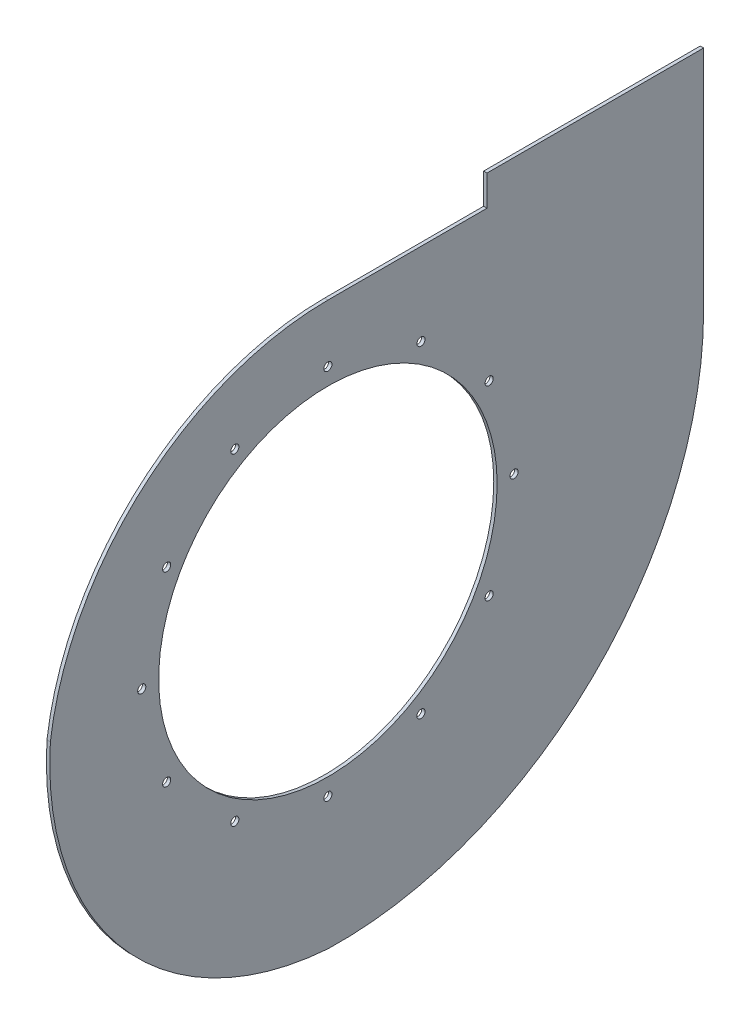
ISO-10303-21;
HEADER;
FILE_DESCRIPTION(('STEP AP214'),'2;1');
FILE_NAME('part.step','',(''),(''),'','','');
FILE_SCHEMA(('AUTOMOTIVE_DESIGN { 1 0 10303 214 1 1 1 1 }'));
ENDSEC;
DATA;
#1=APPLICATION_CONTEXT('core data for automotive mechanical design processes');
#2=APPLICATION_PROTOCOL_DEFINITION('international standard','automotive_design',2000,#1);
#3=PRODUCT_CONTEXT('',#1,'mechanical');
#4=PRODUCT('Part','Part','',(#3));
#5=PRODUCT_RELATED_PRODUCT_CATEGORY('part','',(#4));
#6=PRODUCT_DEFINITION_FORMATION('','',#4);
#7=PRODUCT_DEFINITION_CONTEXT('part definition',#1,'design');
#8=PRODUCT_DEFINITION('design','',#6,#7);
#9=PRODUCT_DEFINITION_SHAPE('','',#8);
#10=(LENGTH_UNIT() NAMED_UNIT(*) SI_UNIT(.MILLI.,.METRE.));
#11=(NAMED_UNIT(*) PLANE_ANGLE_UNIT() SI_UNIT($,.RADIAN.));
#12=(NAMED_UNIT(*) SI_UNIT($,.STERADIAN.) SOLID_ANGLE_UNIT());
#13=UNCERTAINTY_MEASURE_WITH_UNIT(LENGTH_MEASURE(1.E-05),#10,'distance_accuracy_value','');
#14=(GEOMETRIC_REPRESENTATION_CONTEXT(3) GLOBAL_UNCERTAINTY_ASSIGNED_CONTEXT((#13)) GLOBAL_UNIT_ASSIGNED_CONTEXT((#10,
#11,#12)) REPRESENTATION_CONTEXT('',''));
#15=CARTESIAN_POINT('',(0.,0.,0.));
#16=DIRECTION('',(0.,0.,1.));
#17=DIRECTION('',(1.,0.,0.));
#18=AXIS2_PLACEMENT_3D('',#15,#16,#17);
#19=CARTESIAN_POINT('',(5.,-290.185837618395,361.560614636202));
#20=DIRECTION('',(1.,0.,0.));
#21=DIRECTION('',(0.,0.,-1.));
#22=AXIS2_PLACEMENT_3D('',#19,#20,#21);
#23=PLANE('',#22);
#24=CARTESIAN_POINT('',(5.,1.92749378432888,224.485698368693));
#25=DIRECTION('',(1.,0.,0.));
#26=DIRECTION('',(0.,0.86602540378444,-0.499999999999998));
#27=AXIS2_PLACEMENT_3D('',#24,#25,#26);
#28=CIRCLE('',#27,6.);
#29=CARTESIAN_POINT('',(5.,7.12364620703552,221.485698368693));
#30=VERTEX_POINT('',#29);
#31=EDGE_CURVE('E322',#30,#30,#28,.T.);
#32=ORIENTED_EDGE('',*,*,#31,.F.);
#33=EDGE_LOOP('',(#32));
#34=FACE_BOUND('',#33,.T.);
#35=CARTESIAN_POINT('',(5.,38.7705077436079,361.985698368694));
#36=DIRECTION('',(1.,0.,0.));
#37=DIRECTION('',(0.,1.,0.));
#38=AXIS2_PLACEMENT_3D('',#35,#36,#37);
#39=CIRCLE('',#38,6.);
#40=CARTESIAN_POINT('',(5.,44.7705077436079,361.985698368694));
#41=VERTEX_POINT('',#40);
#42=EDGE_CURVE('E325',#41,#41,#39,.T.);
#43=ORIENTED_EDGE('',*,*,#42,.F.);
#44=EDGE_LOOP('',(#43));
#45=FACE_BOUND('',#44,.T.);
#46=CARTESIAN_POINT('',(5.,1.92749378432788,499.485698368694));
#47=DIRECTION('',(1.,0.,0.));
#48=DIRECTION('',(0.,0.866025403784436,0.500000000000004));
#49=AXIS2_PLACEMENT_3D('',#46,#47,#48);
#50=CIRCLE('',#49,6.);
#51=CARTESIAN_POINT('',(5.,7.12364620703451,502.485698368694));
#52=VERTEX_POINT('',#51);
#53=EDGE_CURVE('E328',#52,#52,#50,.T.);
#54=ORIENTED_EDGE('',*,*,#53,.F.);
#55=EDGE_LOOP('',(#54));
#56=FACE_BOUND('',#55,.T.);
#57=CARTESIAN_POINT('',(5.,-98.7294922563935,600.142684409414));
#58=DIRECTION('',(1.,0.,0.));
#59=DIRECTION('',(0.,0.499999999999995,0.866025403784442));
#60=AXIS2_PLACEMENT_3D('',#57,#58,#59);
#61=CIRCLE('',#60,6.);
#62=CARTESIAN_POINT('',(5.,-95.7294922563935,605.338836832121));
#63=VERTEX_POINT('',#62);
#64=EDGE_CURVE('E331',#63,#63,#61,.T.);
#65=ORIENTED_EDGE('',*,*,#64,.F.);
#66=EDGE_LOOP('',(#65));
#67=FACE_BOUND('',#66,.T.);
#68=CARTESIAN_POINT('',(5.,-236.229492256392,636.985698368693));
#69=DIRECTION('',(1.,0.,0.));
#70=DIRECTION('',(0.,0.,1.));
#71=AXIS2_PLACEMENT_3D('',#68,#69,#70);
#72=CIRCLE('',#71,6.);
#73=CARTESIAN_POINT('',(5.,-236.229492256392,642.985698368693));
#74=VERTEX_POINT('',#73);
#75=EDGE_CURVE('E334',#74,#74,#72,.T.);
#76=ORIENTED_EDGE('',*,*,#75,.F.);
#77=EDGE_LOOP('',(#76));
#78=FACE_BOUND('',#77,.T.);
#79=CARTESIAN_POINT('',(5.,-373.729492256394,600.142684409412));
#80=DIRECTION('',(1.,0.,0.));
#81=DIRECTION('',(0.,-0.500000000000007,0.866025403784435));
#82=AXIS2_PLACEMENT_3D('',#79,#80,#81);
#83=CIRCLE('',#82,6.);
#84=CARTESIAN_POINT('',(5.,-376.729492256394,605.338836832119));
#85=VERTEX_POINT('',#84);
#86=EDGE_CURVE('E337',#85,#85,#83,.T.);
#87=ORIENTED_EDGE('',*,*,#86,.F.);
#88=EDGE_LOOP('',(#87));
#89=FACE_BOUND('',#88,.T.);
#90=CARTESIAN_POINT('',(5.,-474.386478297114,499.485698368691));
#91=DIRECTION('',(1.,0.,0.));
#92=DIRECTION('',(0.,-0.866025403784443,0.499999999999992));
#93=AXIS2_PLACEMENT_3D('',#90,#91,#92);
#94=CIRCLE('',#93,6.);
#95=CARTESIAN_POINT('',(5.,-479.582630719821,502.485698368691));
#96=VERTEX_POINT('',#95);
#97=EDGE_CURVE('E318',#96,#96,#94,.T.);
#98=ORIENTED_EDGE('',*,*,#97,.F.);
#99=EDGE_LOOP('',(#98));
#100=FACE_BOUND('',#99,.T.);
#101=CARTESIAN_POINT('',(5.,-511.229492256392,361.98569836869));
#102=DIRECTION('',(1.,0.,0.));
#103=DIRECTION('',(0.,-1.,0.));
#104=AXIS2_PLACEMENT_3D('',#101,#102,#103);
#105=CIRCLE('',#104,6.);
#106=CARTESIAN_POINT('',(5.,-517.229492256392,361.98569836869));
#107=VERTEX_POINT('',#106);
#108=EDGE_CURVE('E314',#107,#107,#105,.T.);
#109=ORIENTED_EDGE('',*,*,#108,.F.);
#110=EDGE_LOOP('',(#109));
#111=FACE_BOUND('',#110,.T.);
#112=CARTESIAN_POINT('',(5.,-474.386478297111,224.48569836869));
#113=DIRECTION('',(1.,0.,0.));
#114=DIRECTION('',(0.,-0.866025403784433,-0.50000000000001));
#115=AXIS2_PLACEMENT_3D('',#112,#113,#114);
#116=CIRCLE('',#115,6.);
#117=CARTESIAN_POINT('',(5.,-479.582630719818,221.48569836869));
#118=VERTEX_POINT('',#117);
#119=EDGE_CURVE('E301',#118,#118,#116,.T.);
#120=ORIENTED_EDGE('',*,*,#119,.F.);
#121=EDGE_LOOP('',(#120));
#122=FACE_BOUND('',#121,.T.);
#123=CARTESIAN_POINT('',(5.,-373.729492256389,123.82871232797));
#124=DIRECTION('',(1.,0.,0.));
#125=DIRECTION('',(0.,-0.499999999999989,-0.866025403784445));
#126=AXIS2_PLACEMENT_3D('',#123,#124,#125);
#127=CIRCLE('',#126,6.);
#128=CARTESIAN_POINT('',(5.,-376.729492256389,118.632559905264));
#129=VERTEX_POINT('',#128);
#130=EDGE_CURVE('E315',#129,#129,#127,.T.);
#131=ORIENTED_EDGE('',*,*,#130,.F.);
#132=EDGE_LOOP('',(#131));
#133=FACE_BOUND('',#132,.T.);
#134=CARTESIAN_POINT('',(5.,-98.7294922563918,123.828712327972));
#135=DIRECTION('',(1.,0.,0.));
#136=DIRECTION('',(0.,0.500000000000001,-0.866025403784438));
#137=AXIS2_PLACEMENT_3D('',#134,#135,#136);
#138=CIRCLE('',#137,6.);
#139=CARTESIAN_POINT('',(5.,-95.7294922563918,118.632559905266));
#140=VERTEX_POINT('',#139);
#141=EDGE_CURVE('E170',#140,#140,#138,.T.);
#142=ORIENTED_EDGE('',*,*,#141,.F.);
#143=EDGE_LOOP('',(#142));
#144=FACE_BOUND('',#143,.T.);
#145=CARTESIAN_POINT('',(5.,-236.229492256392,86.9856983686926));
#146=DIRECTION('',(1.,0.,0.));
#147=DIRECTION('',(0.,0.,-1.));
#148=AXIS2_PLACEMENT_3D('',#145,#146,#147);
#149=CIRCLE('',#148,6.);
#150=CARTESIAN_POINT('',(5.,-236.229492256392,80.9856983686926));
#151=VERTEX_POINT('',#150);
#152=EDGE_CURVE('E165',#151,#151,#149,.T.);
#153=ORIENTED_EDGE('',*,*,#152,.F.);
#154=EDGE_LOOP('',(#153));
#155=FACE_BOUND('',#154,.T.);
#156=DIRECTION('',(0.,-1.,0.));
#157=VECTOR('',#156,1.);
#158=CARTESIAN_POINT('',(5.,168.770507743608,126.985698368693));
#159=LINE('',#158,#157);
#160=CARTESIAN_POINT('',(5.,168.770507743608,126.985698368693));
#161=VERTEX_POINT('',#160);
#162=CARTESIAN_POINT('',(5.,123.770507743608,126.985698368693));
#163=VERTEX_POINT('',#162);
#164=EDGE_CURVE('E152',#161,#163,#159,.T.);
#165=ORIENTED_EDGE('',*,*,#164,.T.);
#166=DIRECTION('',(0.,0.,1.));
#167=VECTOR('',#166,1.);
#168=CARTESIAN_POINT('',(5.,123.770507743608,126.985698368693));
#169=LINE('',#168,#167);
#170=CARTESIAN_POINT('',(5.,123.770507743608,361.985698368693));
#171=VERTEX_POINT('',#170);
#172=EDGE_CURVE('E105',#163,#171,#169,.T.);
#173=ORIENTED_EDGE('',*,*,#172,.T.);
#174=CARTESIAN_POINT('',(5.,-290.185837618395,361.560614636202));
#175=DIRECTION('',(1.,0.,0.));
#176=DIRECTION('',(0.,0.,-1.));
#177=AXIS2_PLACEMENT_3D('',#174,#175,#176);
#178=CIRCLE('',#177,413.956563617061);
#179=CARTESIAN_POINT('',(5.,-236.229492256392,771.985698368693));
#180=VERTEX_POINT('',#179);
#181=EDGE_CURVE('E213',#171,#180,#178,.T.);
#182=ORIENTED_EDGE('',*,*,#181,.T.);
#183=CARTESIAN_POINT('',(5.,-264.276775398884,329.747218068622));
#184=DIRECTION('',(1.,0.,0.));
#185=DIRECTION('',(0.,0.,-1.));
#186=AXIS2_PLACEMENT_3D('',#183,#184,#185);
#187=CIRCLE('',#186,443.126983549626);
#188=CARTESIAN_POINT('',(5.,-706.229492256392,361.985698368693));
#189=VERTEX_POINT('',#188);
#190=EDGE_CURVE('E121',#180,#189,#187,.T.);
#191=ORIENTED_EDGE('',*,*,#190,.T.);
#192=CARTESIAN_POINT('',(5.,-166.625210225188,346.803519257351));
#193=DIRECTION('',(1.,0.,0.));
#194=DIRECTION('',(0.,0.,1.));
#195=AXIS2_PLACEMENT_3D('',#192,#193,#194);
#196=CIRCLE('',#195,539.817820888658);
#197=CARTESIAN_POINT('',(5.,-166.625210225188,-193.014301631307));
#198=VERTEX_POINT('',#197);
#199=EDGE_CURVE('E115',#189,#198,#196,.T.);
#200=ORIENTED_EDGE('',*,*,#199,.T.);
#201=DIRECTION('',(0.,1.,0.));
#202=VECTOR('',#201,1.);
#203=CARTESIAN_POINT('',(5.,168.770507743608,-193.014301631307));
#204=LINE('',#203,#202);
#205=CARTESIAN_POINT('',(5.,168.770507743608,-193.014301631307));
#206=VERTEX_POINT('',#205);
#207=EDGE_CURVE('E119',#198,#206,#204,.T.);
#208=ORIENTED_EDGE('',*,*,#207,.T.);
#209=DIRECTION('',(0.,0.,1.));
#210=VECTOR('',#209,1.);
#211=CARTESIAN_POINT('',(5.,168.770507743608,126.985698368693));
#212=LINE('',#211,#210);
#213=EDGE_CURVE('E65',#206,#161,#212,.T.);
#214=ORIENTED_EDGE('',*,*,#213,.T.);
#215=EDGE_LOOP('',(#165,#173,#182,#191,#200,#208,#214));
#216=FACE_BOUND('',#215,.T.);
#217=CARTESIAN_POINT('',(5.,-236.229492256392,361.985698368693));
#218=DIRECTION('',(1.,0.,0.));
#219=DIRECTION('',(0.,0.,-1.));
#220=AXIS2_PLACEMENT_3D('',#217,#218,#219);
#221=CIRCLE('',#220,250.);
#222=CARTESIAN_POINT('',(5.,-236.229492256392,111.985698368693));
#223=VERTEX_POINT('',#222);
#224=EDGE_CURVE('E143',#223,#223,#221,.T.);
#225=ORIENTED_EDGE('',*,*,#224,.F.);
#226=EDGE_LOOP('',(#225));
#227=FACE_BOUND('',#226,.T.);
#228=ADVANCED_FACE('F46',(#34,#45,#56,#67,#78,#89,#100,#111,#122,#133,#144,#155,#216,#227),#23,.T.);
#229=CARTESIAN_POINT('',(0.,-290.185837618395,361.560614636202));
#230=DIRECTION('',(1.,0.,0.));
#231=DIRECTION('',(0.,0.,-1.));
#232=AXIS2_PLACEMENT_3D('',#229,#230,#231);
#233=PLANE('',#232);
#234=CARTESIAN_POINT('',(0.,1.92749378432888,224.485698368693));
#235=DIRECTION('',(1.,0.,0.));
#236=DIRECTION('',(0.,0.,-1.));
#237=AXIS2_PLACEMENT_3D('',#234,#235,#236);
#238=CIRCLE('',#237,6.);
#239=CARTESIAN_POINT('',(0.,1.92749378432888,218.485698368693));
#240=VERTEX_POINT('',#239);
#241=EDGE_CURVE('E50',#240,#240,#238,.T.);
#242=ORIENTED_EDGE('',*,*,#241,.T.);
#243=EDGE_LOOP('',(#242));
#244=FACE_BOUND('',#243,.T.);
#245=CARTESIAN_POINT('',(0.,38.7705077436079,361.985698368694));
#246=DIRECTION('',(1.,0.,0.));
#247=DIRECTION('',(0.,0.,-1.));
#248=AXIS2_PLACEMENT_3D('',#245,#246,#247);
#249=CIRCLE('',#248,6.);
#250=CARTESIAN_POINT('',(0.,38.7705077436079,355.985698368694));
#251=VERTEX_POINT('',#250);
#252=EDGE_CURVE('E193',#251,#251,#249,.T.);
#253=ORIENTED_EDGE('',*,*,#252,.T.);
#254=EDGE_LOOP('',(#253));
#255=FACE_BOUND('',#254,.T.);
#256=CARTESIAN_POINT('',(0.,1.92749378432788,499.485698368694));
#257=DIRECTION('',(1.,0.,0.));
#258=DIRECTION('',(0.,0.,-1.));
#259=AXIS2_PLACEMENT_3D('',#256,#257,#258);
#260=CIRCLE('',#259,6.);
#261=CARTESIAN_POINT('',(0.,1.92749378432788,493.485698368694));
#262=VERTEX_POINT('',#261);
#263=EDGE_CURVE('E191',#262,#262,#260,.T.);
#264=ORIENTED_EDGE('',*,*,#263,.T.);
#265=EDGE_LOOP('',(#264));
#266=FACE_BOUND('',#265,.T.);
#267=CARTESIAN_POINT('',(0.,-98.7294922563935,600.142684409414));
#268=DIRECTION('',(1.,0.,0.));
#269=DIRECTION('',(0.,0.,-1.));
#270=AXIS2_PLACEMENT_3D('',#267,#268,#269);
#271=CIRCLE('',#270,6.);
#272=CARTESIAN_POINT('',(0.,-98.7294922563935,594.142684409414));
#273=VERTEX_POINT('',#272);
#274=EDGE_CURVE('E188',#273,#273,#271,.T.);
#275=ORIENTED_EDGE('',*,*,#274,.T.);
#276=EDGE_LOOP('',(#275));
#277=FACE_BOUND('',#276,.T.);
#278=CARTESIAN_POINT('',(0.,-236.229492256392,636.985698368693));
#279=DIRECTION('',(1.,0.,0.));
#280=DIRECTION('',(0.,0.,-1.));
#281=AXIS2_PLACEMENT_3D('',#278,#279,#280);
#282=CIRCLE('',#281,6.);
#283=CARTESIAN_POINT('',(0.,-236.229492256392,630.985698368693));
#284=VERTEX_POINT('',#283);
#285=EDGE_CURVE('E185',#284,#284,#282,.T.);
#286=ORIENTED_EDGE('',*,*,#285,.T.);
#287=EDGE_LOOP('',(#286));
#288=FACE_BOUND('',#287,.T.);
#289=CARTESIAN_POINT('',(0.,-373.729492256394,600.142684409412));
#290=DIRECTION('',(1.,0.,0.));
#291=DIRECTION('',(0.,0.,-1.));
#292=AXIS2_PLACEMENT_3D('',#289,#290,#291);
#293=CIRCLE('',#292,6.);
#294=CARTESIAN_POINT('',(0.,-373.729492256394,594.142684409412));
#295=VERTEX_POINT('',#294);
#296=EDGE_CURVE('E182',#295,#295,#293,.T.);
#297=ORIENTED_EDGE('',*,*,#296,.T.);
#298=EDGE_LOOP('',(#297));
#299=FACE_BOUND('',#298,.T.);
#300=CARTESIAN_POINT('',(0.,-474.386478297114,499.485698368691));
#301=DIRECTION('',(1.,0.,0.));
#302=DIRECTION('',(0.,0.,-1.));
#303=AXIS2_PLACEMENT_3D('',#300,#301,#302);
#304=CIRCLE('',#303,6.);
#305=CARTESIAN_POINT('',(0.,-474.386478297114,493.485698368691));
#306=VERTEX_POINT('',#305);
#307=EDGE_CURVE('E179',#306,#306,#304,.T.);
#308=ORIENTED_EDGE('',*,*,#307,.T.);
#309=EDGE_LOOP('',(#308));
#310=FACE_BOUND('',#309,.T.);
#311=CARTESIAN_POINT('',(0.,-511.229492256392,361.98569836869));
#312=DIRECTION('',(1.,0.,0.));
#313=DIRECTION('',(0.,0.,-1.));
#314=AXIS2_PLACEMENT_3D('',#311,#312,#313);
#315=CIRCLE('',#314,6.);
#316=CARTESIAN_POINT('',(0.,-511.229492256392,355.98569836869));
#317=VERTEX_POINT('',#316);
#318=EDGE_CURVE('E176',#317,#317,#315,.T.);
#319=ORIENTED_EDGE('',*,*,#318,.T.);
#320=EDGE_LOOP('',(#319));
#321=FACE_BOUND('',#320,.T.);
#322=CARTESIAN_POINT('',(0.,-474.386478297111,224.48569836869));
#323=DIRECTION('',(1.,0.,0.));
#324=DIRECTION('',(0.,0.,-1.));
#325=AXIS2_PLACEMENT_3D('',#322,#323,#324);
#326=CIRCLE('',#325,6.);
#327=CARTESIAN_POINT('',(0.,-474.386478297111,218.48569836869));
#328=VERTEX_POINT('',#327);
#329=EDGE_CURVE('E173',#328,#328,#326,.T.);
#330=ORIENTED_EDGE('',*,*,#329,.T.);
#331=EDGE_LOOP('',(#330));
#332=FACE_BOUND('',#331,.T.);
#333=CARTESIAN_POINT('',(0.,-373.729492256389,123.82871232797));
#334=DIRECTION('',(1.,0.,0.));
#335=DIRECTION('',(0.,0.,-1.));
#336=AXIS2_PLACEMENT_3D('',#333,#334,#335);
#337=CIRCLE('',#336,6.);
#338=CARTESIAN_POINT('',(0.,-373.729492256389,117.82871232797));
#339=VERTEX_POINT('',#338);
#340=EDGE_CURVE('E169',#339,#339,#337,.T.);
#341=ORIENTED_EDGE('',*,*,#340,.T.);
#342=EDGE_LOOP('',(#341));
#343=FACE_BOUND('',#342,.T.);
#344=CARTESIAN_POINT('',(0.,-98.7294922563918,123.828712327972));
#345=DIRECTION('',(1.,0.,0.));
#346=DIRECTION('',(0.,0.,-1.));
#347=AXIS2_PLACEMENT_3D('',#344,#345,#346);
#348=CIRCLE('',#347,6.);
#349=CARTESIAN_POINT('',(0.,-98.7294922563918,117.828712327972));
#350=VERTEX_POINT('',#349);
#351=EDGE_CURVE('E166',#350,#350,#348,.T.);
#352=ORIENTED_EDGE('',*,*,#351,.T.);
#353=EDGE_LOOP('',(#352));
#354=FACE_BOUND('',#353,.T.);
#355=CARTESIAN_POINT('',(0.,-236.229492256392,86.9856983686926));
#356=DIRECTION('',(1.,0.,0.));
#357=DIRECTION('',(0.,0.,-1.));
#358=AXIS2_PLACEMENT_3D('',#355,#356,#357);
#359=CIRCLE('',#358,6.);
#360=CARTESIAN_POINT('',(0.,-236.229492256392,80.9856983686926));
#361=VERTEX_POINT('',#360);
#362=EDGE_CURVE('E161',#361,#361,#359,.T.);
#363=ORIENTED_EDGE('',*,*,#362,.T.);
#364=EDGE_LOOP('',(#363));
#365=FACE_BOUND('',#364,.T.);
#366=DIRECTION('',(0.,-1.,0.));
#367=VECTOR('',#366,1.);
#368=CARTESIAN_POINT('',(0.,168.770507743608,126.985698368693));
#369=LINE('',#368,#367);
#370=CARTESIAN_POINT('',(0.,168.770507743608,126.985698368693));
#371=VERTEX_POINT('',#370);
#372=CARTESIAN_POINT('',(0.,123.770507743608,126.985698368693));
#373=VERTEX_POINT('',#372);
#374=EDGE_CURVE('E139',#371,#373,#369,.T.);
#375=ORIENTED_EDGE('',*,*,#374,.F.);
#376=DIRECTION('',(0.,0.,1.));
#377=VECTOR('',#376,1.);
#378=CARTESIAN_POINT('',(0.,168.770507743608,126.985698368693));
#379=LINE('',#378,#377);
#380=CARTESIAN_POINT('',(0.,168.770507743608,-193.014301631307));
#381=VERTEX_POINT('',#380);
#382=EDGE_CURVE('E97',#381,#371,#379,.T.);
#383=ORIENTED_EDGE('',*,*,#382,.F.);
#384=DIRECTION('',(0.,1.,0.));
#385=VECTOR('',#384,1.);
#386=CARTESIAN_POINT('',(0.,168.770507743608,-193.014301631307));
#387=LINE('',#386,#385);
#388=CARTESIAN_POINT('',(0.,-166.625210225188,-193.014301631307));
#389=VERTEX_POINT('',#388);
#390=EDGE_CURVE('E91',#389,#381,#387,.T.);
#391=ORIENTED_EDGE('',*,*,#390,.F.);
#392=CARTESIAN_POINT('',(0.,-166.625210225188,346.803519257351));
#393=DIRECTION('',(1.,0.,0.));
#394=DIRECTION('',(0.,0.,1.));
#395=AXIS2_PLACEMENT_3D('',#392,#393,#394);
#396=CIRCLE('',#395,539.817820888658);
#397=CARTESIAN_POINT('',(0.,-706.229492256392,361.985698368693));
#398=VERTEX_POINT('',#397);
#399=EDGE_CURVE('E129',#398,#389,#396,.T.);
#400=ORIENTED_EDGE('',*,*,#399,.F.);
#401=CARTESIAN_POINT('',(0.,-264.276775398884,329.747218068622));
#402=DIRECTION('',(1.,0.,0.));
#403=DIRECTION('',(0.,0.,-1.));
#404=AXIS2_PLACEMENT_3D('',#401,#402,#403);
#405=CIRCLE('',#404,443.126983549626);
#406=CARTESIAN_POINT('',(0.,-236.229492256392,771.985698368693));
#407=VERTEX_POINT('',#406);
#408=EDGE_CURVE('E147',#407,#398,#405,.T.);
#409=ORIENTED_EDGE('',*,*,#408,.F.);
#410=CARTESIAN_POINT('',(0.,-290.185837618395,361.560614636202));
#411=DIRECTION('',(1.,0.,0.));
#412=DIRECTION('',(0.,0.,-1.));
#413=AXIS2_PLACEMENT_3D('',#410,#411,#412);
#414=CIRCLE('',#413,413.956563617061);
#415=CARTESIAN_POINT('',(0.,123.770507743608,361.985698368693));
#416=VERTEX_POINT('',#415);
#417=EDGE_CURVE('E145',#416,#407,#414,.T.);
#418=ORIENTED_EDGE('',*,*,#417,.F.);
#419=DIRECTION('',(0.,0.,1.));
#420=VECTOR('',#419,1.);
#421=CARTESIAN_POINT('',(0.,123.770507743608,126.985698368693));
#422=LINE('',#421,#420);
#423=EDGE_CURVE('E142',#373,#416,#422,.T.);
#424=ORIENTED_EDGE('',*,*,#423,.F.);
#425=EDGE_LOOP('',(#375,#383,#391,#400,#409,#418,#424));
#426=FACE_BOUND('',#425,.T.);
#427=CARTESIAN_POINT('',(0.,-236.229492256392,361.985698368693));
#428=DIRECTION('',(1.,0.,0.));
#429=DIRECTION('',(0.,0.,-1.));
#430=AXIS2_PLACEMENT_3D('',#427,#428,#429);
#431=CIRCLE('',#430,250.);
#432=CARTESIAN_POINT('',(0.,-236.229492256392,111.985698368693));
#433=VERTEX_POINT('',#432);
#434=EDGE_CURVE('E164',#433,#433,#431,.T.);
#435=ORIENTED_EDGE('',*,*,#434,.T.);
#436=EDGE_LOOP('',(#435));
#437=FACE_BOUND('',#436,.T.);
#438=ADVANCED_FACE('F224',(#244,#255,#266,#277,#288,#299,#310,#321,#332,#343,#354,#365,#426,
#437),#233,.F.);
#439=CARTESIAN_POINT('',(5.,168.770507743608,126.985698368693));
#440=DIRECTION('',(0.,0.,-1.));
#441=DIRECTION('',(-1.,0.,0.));
#442=AXIS2_PLACEMENT_3D('',#439,#440,#441);
#443=PLANE('',#442);
#444=ORIENTED_EDGE('',*,*,#374,.T.);
#445=DIRECTION('',(-1.,0.,0.));
#446=VECTOR('',#445,1.);
#447=CARTESIAN_POINT('',(5.,123.770507743608,126.985698368693));
#448=LINE('',#447,#446);
#449=EDGE_CURVE('E13',#163,#373,#448,.T.);
#450=ORIENTED_EDGE('',*,*,#449,.F.);
#451=ORIENTED_EDGE('',*,*,#164,.F.);
#452=DIRECTION('',(-1.,0.,0.));
#453=VECTOR('',#452,1.);
#454=CARTESIAN_POINT('',(5.,168.770507743608,126.985698368693));
#455=LINE('',#454,#453);
#456=EDGE_CURVE('E135',#161,#371,#455,.T.);
#457=ORIENTED_EDGE('',*,*,#456,.T.);
#458=EDGE_LOOP('',(#444,#450,#451,#457));
#459=FACE_BOUND('',#458,.T.);
#460=ADVANCED_FACE('F48',(#459),#443,.F.);
#461=CARTESIAN_POINT('',(5.,123.770507743608,126.985698368693));
#462=DIRECTION('',(0.,-1.,0.));
#463=DIRECTION('',(0.,0.,-1.));
#464=AXIS2_PLACEMENT_3D('',#461,#462,#463);
#465=PLANE('',#464);
#466=ORIENTED_EDGE('',*,*,#423,.T.);
#467=DIRECTION('',(-1.,0.,0.));
#468=VECTOR('',#467,1.);
#469=CARTESIAN_POINT('',(5.,123.770507743608,361.985698368693));
#470=LINE('',#469,#468);
#471=EDGE_CURVE('E56',#171,#416,#470,.T.);
#472=ORIENTED_EDGE('',*,*,#471,.F.);
#473=ORIENTED_EDGE('',*,*,#172,.F.);
#474=ORIENTED_EDGE('',*,*,#449,.T.);
#475=EDGE_LOOP('',(#466,#472,#473,#474));
#476=FACE_BOUND('',#475,.T.);
#477=ADVANCED_FACE('F482',(#476),#465,.F.);
#478=CARTESIAN_POINT('',(5.,-290.185837618395,361.560614636202));
#479=DIRECTION('',(-1.,0.,0.));
#480=DIRECTION('',(0.,0.,1.));
#481=AXIS2_PLACEMENT_3D('',#478,#479,#480);
#482=CYLINDRICAL_SURFACE('',#481,413.956563617061);
#483=ORIENTED_EDGE('',*,*,#417,.T.);
#484=DIRECTION('',(-1.,0.,0.));
#485=VECTOR('',#484,1.);
#486=CARTESIAN_POINT('',(5.,-236.229492256392,771.985698368693));
#487=LINE('',#486,#485);
#488=EDGE_CURVE('E156',#180,#407,#487,.T.);
#489=ORIENTED_EDGE('',*,*,#488,.F.);
#490=ORIENTED_EDGE('',*,*,#181,.F.);
#491=ORIENTED_EDGE('',*,*,#471,.T.);
#492=EDGE_LOOP('',(#483,#489,#490,#491));
#493=FACE_BOUND('',#492,.T.);
#494=ADVANCED_FACE('F217',(#493),#482,.T.);
#495=CARTESIAN_POINT('',(5.,-264.276775398884,329.747218068622));
#496=DIRECTION('',(-1.,0.,0.));
#497=DIRECTION('',(0.,0.,1.));
#498=AXIS2_PLACEMENT_3D('',#495,#496,#497);
#499=CYLINDRICAL_SURFACE('',#498,443.126983549626);
#500=ORIENTED_EDGE('',*,*,#408,.T.);
#501=DIRECTION('',(-1.,0.,0.));
#502=VECTOR('',#501,1.);
#503=CARTESIAN_POINT('',(5.,-706.229492256392,361.985698368693));
#504=LINE('',#503,#502);
#505=EDGE_CURVE('E130',#189,#398,#504,.T.);
#506=ORIENTED_EDGE('',*,*,#505,.F.);
#507=ORIENTED_EDGE('',*,*,#190,.F.);
#508=ORIENTED_EDGE('',*,*,#488,.T.);
#509=EDGE_LOOP('',(#500,#506,#507,#508));
#510=FACE_BOUND('',#509,.T.);
#511=ADVANCED_FACE('F221',(#510),#499,.T.);
#512=CARTESIAN_POINT('',(5.,-166.625210225188,346.803519257351));
#513=DIRECTION('',(-1.,0.,0.));
#514=DIRECTION('',(0.,0.,1.));
#515=AXIS2_PLACEMENT_3D('',#512,#513,#514);
#516=CYLINDRICAL_SURFACE('',#515,539.817820888658);
#517=ORIENTED_EDGE('',*,*,#399,.T.);
#518=DIRECTION('',(-1.,0.,0.));
#519=VECTOR('',#518,1.);
#520=CARTESIAN_POINT('',(5.,-166.625210225188,-193.014301631307));
#521=LINE('',#520,#519);
#522=EDGE_CURVE('E126',#198,#389,#521,.T.);
#523=ORIENTED_EDGE('',*,*,#522,.F.);
#524=ORIENTED_EDGE('',*,*,#199,.F.);
#525=ORIENTED_EDGE('',*,*,#505,.T.);
#526=EDGE_LOOP('',(#517,#523,#524,#525));
#527=FACE_BOUND('',#526,.T.);
#528=ADVANCED_FACE('F127',(#527),#516,.T.);
#529=CARTESIAN_POINT('',(5.,168.770507743608,-193.014301631307));
#530=DIRECTION('',(0.,0.,1.));
#531=DIRECTION('',(0.,-1.,0.));
#532=AXIS2_PLACEMENT_3D('',#529,#530,#531);
#533=PLANE('',#532);
#534=ORIENTED_EDGE('',*,*,#390,.T.);
#535=DIRECTION('',(-1.,0.,0.));
#536=VECTOR('',#535,1.);
#537=CARTESIAN_POINT('',(5.,168.770507743608,-193.014301631307));
#538=LINE('',#537,#536);
#539=EDGE_CURVE('E131',#206,#381,#538,.T.);
#540=ORIENTED_EDGE('',*,*,#539,.F.);
#541=ORIENTED_EDGE('',*,*,#207,.F.);
#542=ORIENTED_EDGE('',*,*,#522,.T.);
#543=EDGE_LOOP('',(#534,#540,#541,#542));
#544=FACE_BOUND('',#543,.T.);
#545=ADVANCED_FACE('F133',(#544),#533,.F.);
#546=CARTESIAN_POINT('',(5.,168.770507743608,126.985698368693));
#547=DIRECTION('',(0.,-1.,0.));
#548=DIRECTION('',(0.,0.,-1.));
#549=AXIS2_PLACEMENT_3D('',#546,#547,#548);
#550=PLANE('',#549);
#551=ORIENTED_EDGE('',*,*,#382,.T.);
#552=ORIENTED_EDGE('',*,*,#456,.F.);
#553=ORIENTED_EDGE('',*,*,#213,.F.);
#554=ORIENTED_EDGE('',*,*,#539,.T.);
#555=EDGE_LOOP('',(#551,#552,#553,#554));
#556=FACE_BOUND('',#555,.T.);
#557=ADVANCED_FACE('F229',(#556),#550,.F.);
#558=CARTESIAN_POINT('',(5.,-236.229492256392,361.985698368693));
#559=DIRECTION('',(-1.,0.,0.));
#560=DIRECTION('',(0.,0.,1.));
#561=AXIS2_PLACEMENT_3D('',#558,#559,#560);
#562=CYLINDRICAL_SURFACE('',#561,250.);
#563=ORIENTED_EDGE('',*,*,#224,.T.);
#564=EDGE_LOOP('',(#563));
#565=FACE_BOUND('',#564,.T.);
#566=ORIENTED_EDGE('',*,*,#434,.F.);
#567=EDGE_LOOP('',(#566));
#568=FACE_BOUND('',#567,.T.);
#569=ADVANCED_FACE('F231',(#565,#568),#562,.F.);
#570=CARTESIAN_POINT('',(-5.,-236.229492256392,86.9856983686926));
#571=DIRECTION('',(1.,0.,0.));
#572=DIRECTION('',(0.,0.,-1.));
#573=AXIS2_PLACEMENT_3D('',#570,#571,#572);
#574=CYLINDRICAL_SURFACE('',#573,6.);
#575=ORIENTED_EDGE('',*,*,#152,.T.);
#576=EDGE_LOOP('',(#575));
#577=FACE_BOUND('',#576,.T.);
#578=ORIENTED_EDGE('',*,*,#362,.F.);
#579=EDGE_LOOP('',(#578));
#580=FACE_BOUND('',#579,.T.);
#581=ADVANCED_FACE('F237',(#577,#580),#574,.F.);
#582=CARTESIAN_POINT('',(-5.,-98.7294922563918,123.828712327972));
#583=DIRECTION('',(1.,0.,0.));
#584=DIRECTION('',(0.,0.,-1.));
#585=AXIS2_PLACEMENT_3D('',#582,#583,#584);
#586=CYLINDRICAL_SURFACE('',#585,6.);
#587=ORIENTED_EDGE('',*,*,#141,.T.);
#588=EDGE_LOOP('',(#587));
#589=FACE_BOUND('',#588,.T.);
#590=ORIENTED_EDGE('',*,*,#351,.F.);
#591=EDGE_LOOP('',(#590));
#592=FACE_BOUND('',#591,.T.);
#593=ADVANCED_FACE('F253',(#589,#592),#586,.F.);
#594=CARTESIAN_POINT('',(-5.,-373.729492256389,123.82871232797));
#595=DIRECTION('',(1.,0.,0.));
#596=DIRECTION('',(0.,0.,-1.));
#597=AXIS2_PLACEMENT_3D('',#594,#595,#596);
#598=CYLINDRICAL_SURFACE('',#597,6.);
#599=ORIENTED_EDGE('',*,*,#130,.T.);
#600=EDGE_LOOP('',(#599));
#601=FACE_BOUND('',#600,.T.);
#602=ORIENTED_EDGE('',*,*,#340,.F.);
#603=EDGE_LOOP('',(#602));
#604=FACE_BOUND('',#603,.T.);
#605=ADVANCED_FACE('F256',(#601,#604),#598,.F.);
#606=CARTESIAN_POINT('',(-5.,-474.386478297111,224.48569836869));
#607=DIRECTION('',(1.,0.,0.));
#608=DIRECTION('',(0.,0.,-1.));
#609=AXIS2_PLACEMENT_3D('',#606,#607,#608);
#610=CYLINDRICAL_SURFACE('',#609,6.);
#611=ORIENTED_EDGE('',*,*,#119,.T.);
#612=EDGE_LOOP('',(#611));
#613=FACE_BOUND('',#612,.T.);
#614=ORIENTED_EDGE('',*,*,#329,.F.);
#615=EDGE_LOOP('',(#614));
#616=FACE_BOUND('',#615,.T.);
#617=ADVANCED_FACE('F262',(#613,#616),#610,.F.);
#618=CARTESIAN_POINT('',(-5.,-511.229492256392,361.98569836869));
#619=DIRECTION('',(1.,0.,0.));
#620=DIRECTION('',(0.,0.,-1.));
#621=AXIS2_PLACEMENT_3D('',#618,#619,#620);
#622=CYLINDRICAL_SURFACE('',#621,6.);
#623=ORIENTED_EDGE('',*,*,#108,.T.);
#624=EDGE_LOOP('',(#623));
#625=FACE_BOUND('',#624,.T.);
#626=ORIENTED_EDGE('',*,*,#318,.F.);
#627=EDGE_LOOP('',(#626));
#628=FACE_BOUND('',#627,.T.);
#629=ADVANCED_FACE('F258',(#625,#628),#622,.F.);
#630=CARTESIAN_POINT('',(-5.,-474.386478297114,499.485698368691));
#631=DIRECTION('',(1.,0.,0.));
#632=DIRECTION('',(0.,0.,-1.));
#633=AXIS2_PLACEMENT_3D('',#630,#631,#632);
#634=CYLINDRICAL_SURFACE('',#633,6.);
#635=ORIENTED_EDGE('',*,*,#97,.T.);
#636=EDGE_LOOP('',(#635));
#637=FACE_BOUND('',#636,.T.);
#638=ORIENTED_EDGE('',*,*,#307,.F.);
#639=EDGE_LOOP('',(#638));
#640=FACE_BOUND('',#639,.T.);
#641=ADVANCED_FACE('F261',(#637,#640),#634,.F.);
#642=CARTESIAN_POINT('',(-5.,-373.729492256394,600.142684409412));
#643=DIRECTION('',(1.,0.,0.));
#644=DIRECTION('',(0.,0.,-1.));
#645=AXIS2_PLACEMENT_3D('',#642,#643,#644);
#646=CYLINDRICAL_SURFACE('',#645,6.);
#647=ORIENTED_EDGE('',*,*,#86,.T.);
#648=EDGE_LOOP('',(#647));
#649=FACE_BOUND('',#648,.T.);
#650=ORIENTED_EDGE('',*,*,#296,.F.);
#651=EDGE_LOOP('',(#650));
#652=FACE_BOUND('',#651,.T.);
#653=ADVANCED_FACE('F266',(#649,#652),#646,.F.);
#654=CARTESIAN_POINT('',(-5.,-236.229492256392,636.985698368693));
#655=DIRECTION('',(1.,0.,0.));
#656=DIRECTION('',(0.,0.,-1.));
#657=AXIS2_PLACEMENT_3D('',#654,#655,#656);
#658=CYLINDRICAL_SURFACE('',#657,6.);
#659=ORIENTED_EDGE('',*,*,#75,.T.);
#660=EDGE_LOOP('',(#659));
#661=FACE_BOUND('',#660,.T.);
#662=ORIENTED_EDGE('',*,*,#285,.F.);
#663=EDGE_LOOP('',(#662));
#664=FACE_BOUND('',#663,.T.);
#665=ADVANCED_FACE('F270',(#661,#664),#658,.F.);
#666=CARTESIAN_POINT('',(-5.,-98.7294922563935,600.142684409414));
#667=DIRECTION('',(1.,0.,0.));
#668=DIRECTION('',(0.,0.,-1.));
#669=AXIS2_PLACEMENT_3D('',#666,#667,#668);
#670=CYLINDRICAL_SURFACE('',#669,6.);
#671=ORIENTED_EDGE('',*,*,#64,.T.);
#672=EDGE_LOOP('',(#671));
#673=FACE_BOUND('',#672,.T.);
#674=ORIENTED_EDGE('',*,*,#274,.F.);
#675=EDGE_LOOP('',(#674));
#676=FACE_BOUND('',#675,.T.);
#677=ADVANCED_FACE('F274',(#673,#676),#670,.F.);
#678=CARTESIAN_POINT('',(-5.,1.92749378432788,499.485698368694));
#679=DIRECTION('',(1.,0.,0.));
#680=DIRECTION('',(0.,0.,-1.));
#681=AXIS2_PLACEMENT_3D('',#678,#679,#680);
#682=CYLINDRICAL_SURFACE('',#681,6.);
#683=ORIENTED_EDGE('',*,*,#53,.T.);
#684=EDGE_LOOP('',(#683));
#685=FACE_BOUND('',#684,.T.);
#686=ORIENTED_EDGE('',*,*,#263,.F.);
#687=EDGE_LOOP('',(#686));
#688=FACE_BOUND('',#687,.T.);
#689=ADVANCED_FACE('F278',(#685,#688),#682,.F.);
#690=CARTESIAN_POINT('',(-5.,38.7705077436079,361.985698368694));
#691=DIRECTION('',(1.,0.,0.));
#692=DIRECTION('',(0.,0.,-1.));
#693=AXIS2_PLACEMENT_3D('',#690,#691,#692);
#694=CYLINDRICAL_SURFACE('',#693,6.);
#695=ORIENTED_EDGE('',*,*,#42,.T.);
#696=EDGE_LOOP('',(#695));
#697=FACE_BOUND('',#696,.T.);
#698=ORIENTED_EDGE('',*,*,#252,.F.);
#699=EDGE_LOOP('',(#698));
#700=FACE_BOUND('',#699,.T.);
#701=ADVANCED_FACE('F282',(#697,#700),#694,.F.);
#702=CARTESIAN_POINT('',(-5.,1.92749378432888,224.485698368693));
#703=DIRECTION('',(1.,0.,0.));
#704=DIRECTION('',(0.,0.,-1.));
#705=AXIS2_PLACEMENT_3D('',#702,#703,#704);
#706=CYLINDRICAL_SURFACE('',#705,6.);
#707=ORIENTED_EDGE('',*,*,#31,.T.);
#708=EDGE_LOOP('',(#707));
#709=FACE_BOUND('',#708,.T.);
#710=ORIENTED_EDGE('',*,*,#241,.F.);
#711=EDGE_LOOP('',(#710));
#712=FACE_BOUND('',#711,.T.);
#713=ADVANCED_FACE('F286',(#709,#712),#706,.F.);
#714=CLOSED_SHELL('',(#228,#438,#460,#477,#494,#511,#528,#545,#557,#569,#581,#593,#605,#617,
#629,#641,#653,#665,#677,#689,#701,#713));
#715=MANIFOLD_SOLID_BREP('B2',#714);
#716=ADVANCED_BREP_SHAPE_REPRESENTATION('',(#18,#715),#14);
#717=SHAPE_DEFINITION_REPRESENTATION(#9,#716);
ENDSEC;
END-ISO-10303-21;
